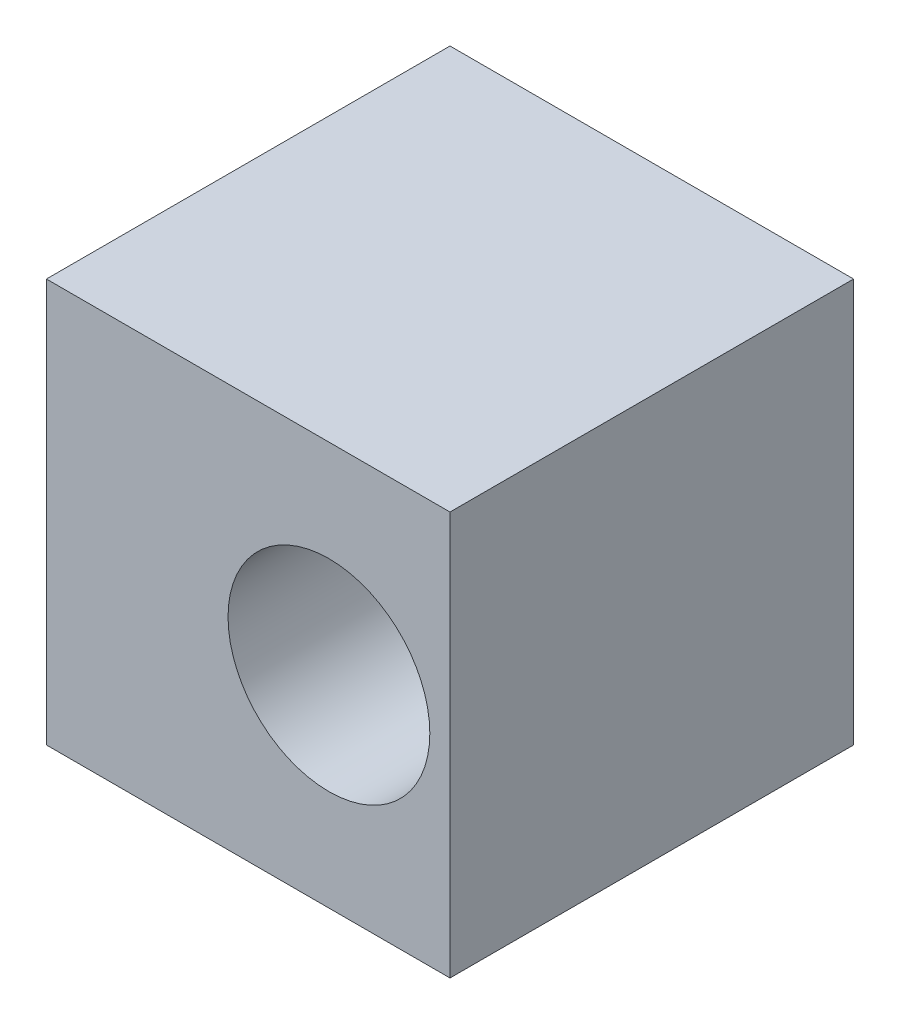
ISO-10303-21;
HEADER;
FILE_DESCRIPTION(('STEP AP214'),'2;1');
FILE_NAME('part.step','',(''),(''),'','','');
FILE_SCHEMA(('AUTOMOTIVE_DESIGN { 1 0 10303 214 1 1 1 1 }'));
ENDSEC;
DATA;
#1=APPLICATION_CONTEXT('core data for automotive mechanical design processes');
#2=APPLICATION_PROTOCOL_DEFINITION('international standard','automotive_design',2000,#1);
#3=PRODUCT_CONTEXT('',#1,'mechanical');
#4=PRODUCT('Part','Part','',(#3));
#5=PRODUCT_RELATED_PRODUCT_CATEGORY('part','',(#4));
#6=PRODUCT_DEFINITION_FORMATION('','',#4);
#7=PRODUCT_DEFINITION_CONTEXT('part definition',#1,'design');
#8=PRODUCT_DEFINITION('design','',#6,#7);
#9=PRODUCT_DEFINITION_SHAPE('','',#8);
#10=(LENGTH_UNIT() NAMED_UNIT(*) SI_UNIT(.MILLI.,.METRE.));
#11=(NAMED_UNIT(*) PLANE_ANGLE_UNIT() SI_UNIT($,.RADIAN.));
#12=(NAMED_UNIT(*) SI_UNIT($,.STERADIAN.) SOLID_ANGLE_UNIT());
#13=UNCERTAINTY_MEASURE_WITH_UNIT(LENGTH_MEASURE(1.E-05),#10,'distance_accuracy_value','');
#14=(GEOMETRIC_REPRESENTATION_CONTEXT(3) GLOBAL_UNCERTAINTY_ASSIGNED_CONTEXT((#13)) GLOBAL_UNIT_ASSIGNED_CONTEXT((#10,
#11,#12)) REPRESENTATION_CONTEXT('',''));
#15=CARTESIAN_POINT('',(0.,0.,0.));
#16=DIRECTION('',(0.,0.,1.));
#17=DIRECTION('',(1.,0.,0.));
#18=AXIS2_PLACEMENT_3D('',#15,#16,#17);
#19=CARTESIAN_POINT('',(0.,0.,10.));
#20=DIRECTION('',(1.,0.,0.));
#21=DIRECTION('',(0.,0.,-1.));
#22=AXIS2_PLACEMENT_3D('',#19,#20,#21);
#23=PLANE('',#22);
#24=DIRECTION('',(0.,-1.,0.));
#25=VECTOR('',#24,1.);
#26=CARTESIAN_POINT('',(0.,0.,0.));
#27=LINE('',#26,#25);
#28=CARTESIAN_POINT('',(0.,10.,0.));
#29=VERTEX_POINT('',#28);
#30=CARTESIAN_POINT('',(0.,0.,0.));
#31=VERTEX_POINT('',#30);
#32=EDGE_CURVE('E98',#29,#31,#27,.T.);
#33=ORIENTED_EDGE('',*,*,#32,.T.);
#34=DIRECTION('',(0.,0.,-1.));
#35=VECTOR('',#34,1.);
#36=CARTESIAN_POINT('',(0.,0.,10.));
#37=LINE('',#36,#35);
#38=CARTESIAN_POINT('',(0.,0.,10.));
#39=VERTEX_POINT('',#38);
#40=EDGE_CURVE('E11',#39,#31,#37,.T.);
#41=ORIENTED_EDGE('',*,*,#40,.F.);
#42=DIRECTION('',(0.,-1.,0.));
#43=VECTOR('',#42,1.);
#44=CARTESIAN_POINT('',(0.,0.,10.));
#45=LINE('',#44,#43);
#46=CARTESIAN_POINT('',(0.,10.,10.));
#47=VERTEX_POINT('',#46);
#48=EDGE_CURVE('E86',#47,#39,#45,.T.);
#49=ORIENTED_EDGE('',*,*,#48,.F.);
#50=DIRECTION('',(0.,0.,-1.));
#51=VECTOR('',#50,1.);
#52=CARTESIAN_POINT('',(0.,10.,10.));
#53=LINE('',#52,#51);
#54=EDGE_CURVE('E94',#47,#29,#53,.T.);
#55=ORIENTED_EDGE('',*,*,#54,.T.);
#56=EDGE_LOOP('',(#33,#41,#49,#55));
#57=FACE_BOUND('',#56,.T.);
#58=ADVANCED_FACE('F35',(#57),#23,.F.);
#59=CARTESIAN_POINT('',(0.,0.,10.));
#60=DIRECTION('',(0.,1.,0.));
#61=DIRECTION('',(0.,0.,1.));
#62=AXIS2_PLACEMENT_3D('',#59,#60,#61);
#63=PLANE('',#62);
#64=DIRECTION('',(1.,0.,0.));
#65=VECTOR('',#64,1.);
#66=CARTESIAN_POINT('',(0.,0.,0.));
#67=LINE('',#66,#65);
#68=CARTESIAN_POINT('',(10.,0.,0.));
#69=VERTEX_POINT('',#68);
#70=EDGE_CURVE('E90',#31,#69,#67,.T.);
#71=ORIENTED_EDGE('',*,*,#70,.T.);
#72=DIRECTION('',(0.,0.,-1.));
#73=VECTOR('',#72,1.);
#74=CARTESIAN_POINT('',(10.,0.,10.));
#75=LINE('',#74,#73);
#76=CARTESIAN_POINT('',(10.,0.,10.));
#77=VERTEX_POINT('',#76);
#78=EDGE_CURVE('E43',#77,#69,#75,.T.);
#79=ORIENTED_EDGE('',*,*,#78,.F.);
#80=DIRECTION('',(1.,0.,0.));
#81=VECTOR('',#80,1.);
#82=CARTESIAN_POINT('',(0.,0.,10.));
#83=LINE('',#82,#81);
#84=EDGE_CURVE('E81',#39,#77,#83,.T.);
#85=ORIENTED_EDGE('',*,*,#84,.F.);
#86=ORIENTED_EDGE('',*,*,#40,.T.);
#87=EDGE_LOOP('',(#71,#79,#85,#86));
#88=FACE_BOUND('',#87,.T.);
#89=ADVANCED_FACE('F89',(#88),#63,.F.);
#90=CARTESIAN_POINT('',(10.,0.,10.));
#91=DIRECTION('',(-1.,0.,0.));
#92=DIRECTION('',(0.,0.,1.));
#93=AXIS2_PLACEMENT_3D('',#90,#91,#92);
#94=PLANE('',#93);
#95=DIRECTION('',(0.,1.,0.));
#96=VECTOR('',#95,1.);
#97=CARTESIAN_POINT('',(10.,0.,0.));
#98=LINE('',#97,#96);
#99=CARTESIAN_POINT('',(10.,10.,0.));
#100=VERTEX_POINT('',#99);
#101=EDGE_CURVE('E68',#69,#100,#98,.T.);
#102=ORIENTED_EDGE('',*,*,#101,.T.);
#103=DIRECTION('',(0.,0.,-1.));
#104=VECTOR('',#103,1.);
#105=CARTESIAN_POINT('',(10.,10.,10.));
#106=LINE('',#105,#104);
#107=CARTESIAN_POINT('',(10.,10.,10.));
#108=VERTEX_POINT('',#107);
#109=EDGE_CURVE('E91',#108,#100,#106,.T.);
#110=ORIENTED_EDGE('',*,*,#109,.F.);
#111=DIRECTION('',(0.,1.,0.));
#112=VECTOR('',#111,1.);
#113=CARTESIAN_POINT('',(10.,0.,10.));
#114=LINE('',#113,#112);
#115=EDGE_CURVE('E84',#77,#108,#114,.T.);
#116=ORIENTED_EDGE('',*,*,#115,.F.);
#117=ORIENTED_EDGE('',*,*,#78,.T.);
#118=EDGE_LOOP('',(#102,#110,#116,#117));
#119=FACE_BOUND('',#118,.T.);
#120=ADVANCED_FACE('F92',(#119),#94,.F.);
#121=CARTESIAN_POINT('',(0.,10.,10.));
#122=DIRECTION('',(0.,-1.,0.));
#123=DIRECTION('',(0.,0.,-1.));
#124=AXIS2_PLACEMENT_3D('',#121,#122,#123);
#125=PLANE('',#124);
#126=DIRECTION('',(-1.,0.,0.));
#127=VECTOR('',#126,1.);
#128=CARTESIAN_POINT('',(0.,10.,0.));
#129=LINE('',#128,#127);
#130=EDGE_CURVE('E74',#100,#29,#129,.T.);
#131=ORIENTED_EDGE('',*,*,#130,.T.);
#132=ORIENTED_EDGE('',*,*,#54,.F.);
#133=DIRECTION('',(-1.,0.,0.));
#134=VECTOR('',#133,1.);
#135=CARTESIAN_POINT('',(0.,10.,10.));
#136=LINE('',#135,#134);
#137=EDGE_CURVE('E51',#108,#47,#136,.T.);
#138=ORIENTED_EDGE('',*,*,#137,.F.);
#139=ORIENTED_EDGE('',*,*,#109,.T.);
#140=EDGE_LOOP('',(#131,#132,#138,#139));
#141=FACE_BOUND('',#140,.T.);
#142=ADVANCED_FACE('F106',(#141),#125,.F.);
#143=CARTESIAN_POINT('',(0.,0.,10.));
#144=DIRECTION('',(0.,0.,-1.));
#145=DIRECTION('',(-1.,0.,0.));
#146=AXIS2_PLACEMENT_3D('',#143,#144,#145);
#147=PLANE('',#146);
#148=CARTESIAN_POINT('',(7.,5.,10.));
#149=DIRECTION('',(0.,0.,1.));
#150=DIRECTION('',(1.,0.,0.));
#151=AXIS2_PLACEMENT_3D('',#148,#149,#150);
#152=CIRCLE('',#151,2.5);
#153=CARTESIAN_POINT('',(9.5,5.,10.));
#154=VERTEX_POINT('',#153);
#155=EDGE_CURVE('E101',#154,#154,#152,.T.);
#156=ORIENTED_EDGE('',*,*,#155,.F.);
#157=EDGE_LOOP('',(#156));
#158=FACE_BOUND('',#157,.T.);
#159=ORIENTED_EDGE('',*,*,#48,.T.);
#160=ORIENTED_EDGE('',*,*,#84,.T.);
#161=ORIENTED_EDGE('',*,*,#115,.T.);
#162=ORIENTED_EDGE('',*,*,#137,.T.);
#163=EDGE_LOOP('',(#159,#160,#161,#162));
#164=FACE_BOUND('',#163,.T.);
#165=ADVANCED_FACE('F82',(#158,#164),#147,.F.);
#166=CARTESIAN_POINT('',(0.,0.,0.));
#167=DIRECTION('',(0.,0.,-1.));
#168=DIRECTION('',(-1.,0.,0.));
#169=AXIS2_PLACEMENT_3D('',#166,#167,#168);
#170=PLANE('',#169);
#171=CARTESIAN_POINT('',(7.,5.,0.));
#172=DIRECTION('',(0.,0.,1.));
#173=DIRECTION('',(1.,0.,0.));
#174=AXIS2_PLACEMENT_3D('',#171,#172,#173);
#175=CIRCLE('',#174,2.5);
#176=CARTESIAN_POINT('',(9.5,5.,0.));
#177=VERTEX_POINT('',#176);
#178=EDGE_CURVE('E112',#177,#177,#175,.T.);
#179=ORIENTED_EDGE('',*,*,#178,.T.);
#180=EDGE_LOOP('',(#179));
#181=FACE_BOUND('',#180,.T.);
#182=ORIENTED_EDGE('',*,*,#32,.F.);
#183=ORIENTED_EDGE('',*,*,#130,.F.);
#184=ORIENTED_EDGE('',*,*,#101,.F.);
#185=ORIENTED_EDGE('',*,*,#70,.F.);
#186=EDGE_LOOP('',(#182,#183,#184,#185));
#187=FACE_BOUND('',#186,.T.);
#188=ADVANCED_FACE('F109',(#181,#187),#170,.T.);
#189=CARTESIAN_POINT('',(7.,5.,10.));
#190=DIRECTION('',(0.,0.,-1.));
#191=DIRECTION('',(-1.,0.,0.));
#192=AXIS2_PLACEMENT_3D('',#189,#190,#191);
#193=CYLINDRICAL_SURFACE('',#192,2.5);
#194=ORIENTED_EDGE('',*,*,#155,.T.);
#195=EDGE_LOOP('',(#194));
#196=FACE_BOUND('',#195,.T.);
#197=ORIENTED_EDGE('',*,*,#178,.F.);
#198=EDGE_LOOP('',(#197));
#199=FACE_BOUND('',#198,.T.);
#200=ADVANCED_FACE('F118',(#196,#199),#193,.F.);
#201=CLOSED_SHELL('',(#58,#89,#120,#142,#165,#188,#200));
#202=MANIFOLD_SOLID_BREP('B2',#201);
#203=ADVANCED_BREP_SHAPE_REPRESENTATION('',(#18,#202),#14);
#204=SHAPE_DEFINITION_REPRESENTATION(#9,#203);
ENDSEC;
END-ISO-10303-21;
